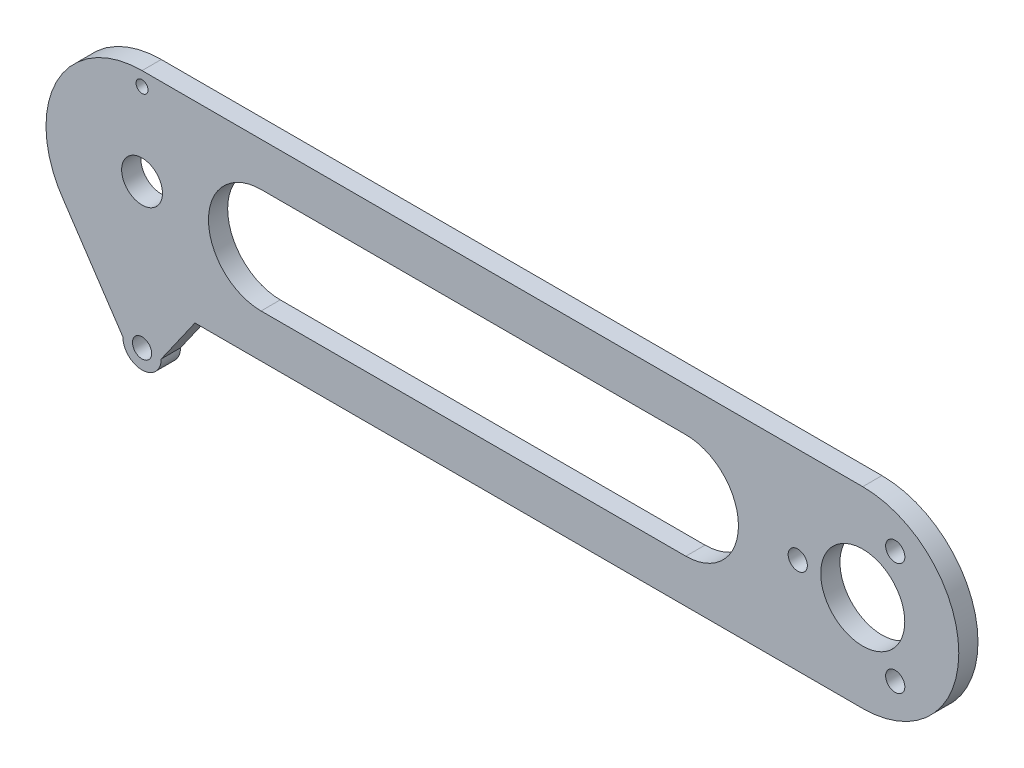
ISO-10303-21;
HEADER;
FILE_DESCRIPTION(('STEP AP214'),'2;1');
FILE_NAME('part.step','',(''),(''),'','','');
FILE_SCHEMA(('AUTOMOTIVE_DESIGN { 1 0 10303 214 1 1 1 1 }'));
ENDSEC;
DATA;
#1=APPLICATION_CONTEXT('core data for automotive mechanical design processes');
#2=APPLICATION_PROTOCOL_DEFINITION('international standard','automotive_design',2000,#1);
#3=PRODUCT_CONTEXT('',#1,'mechanical');
#4=PRODUCT('Part','Part','',(#3));
#5=PRODUCT_RELATED_PRODUCT_CATEGORY('part','',(#4));
#6=PRODUCT_DEFINITION_FORMATION('','',#4);
#7=PRODUCT_DEFINITION_CONTEXT('part definition',#1,'design');
#8=PRODUCT_DEFINITION('design','',#6,#7);
#9=PRODUCT_DEFINITION_SHAPE('','',#8);
#10=(LENGTH_UNIT() NAMED_UNIT(*) SI_UNIT(.MILLI.,.METRE.));
#11=(NAMED_UNIT(*) PLANE_ANGLE_UNIT() SI_UNIT($,.RADIAN.));
#12=(NAMED_UNIT(*) SI_UNIT($,.STERADIAN.) SOLID_ANGLE_UNIT());
#13=UNCERTAINTY_MEASURE_WITH_UNIT(LENGTH_MEASURE(1.E-05),#10,'distance_accuracy_value','');
#14=(GEOMETRIC_REPRESENTATION_CONTEXT(3) GLOBAL_UNCERTAINTY_ASSIGNED_CONTEXT((#13)) GLOBAL_UNIT_ASSIGNED_CONTEXT((#10,
#11,#12)) REPRESENTATION_CONTEXT('',''));
#15=CARTESIAN_POINT('',(0.,0.,0.));
#16=DIRECTION('',(0.,0.,1.));
#17=DIRECTION('',(1.,0.,0.));
#18=AXIS2_PLACEMENT_3D('',#15,#16,#17);
#19=CARTESIAN_POINT('',(-1.00000000000001,0.,4.));
#20=DIRECTION('',(0.,0.,-1.));
#21=DIRECTION('',(-1.,0.,0.));
#22=AXIS2_PLACEMENT_3D('',#19,#20,#21);
#23=PLANE('',#22);
#24=CARTESIAN_POINT('',(155.82929500564,11.7173237132035,4.));
#25=DIRECTION('',(0.,0.,1.));
#26=DIRECTION('',(1.,0.,0.));
#27=AXIS2_PLACEMENT_3D('',#24,#25,#26);
#28=CIRCLE('',#27,2.);
#29=CARTESIAN_POINT('',(157.82929500564,11.7173237132035,4.));
#30=VERTEX_POINT('',#29);
#31=EDGE_CURVE('E174',#30,#30,#28,.T.);
#32=ORIENTED_EDGE('',*,*,#31,.F.);
#33=EDGE_LOOP('',(#32));
#34=FACE_BOUND('',#33,.T.);
#35=CARTESIAN_POINT('',(-0.999999999999992,-30.,4.));
#36=DIRECTION('',(0.,0.,1.));
#37=DIRECTION('',(1.,0.,0.));
#38=AXIS2_PLACEMENT_3D('',#35,#36,#37);
#39=CIRCLE('',#38,2.);
#40=CARTESIAN_POINT('',(1.00000000000001,-30.,4.));
#41=VERTEX_POINT('',#40);
#42=EDGE_CURVE('E182',#41,#41,#39,.T.);
#43=ORIENTED_EDGE('',*,*,#42,.F.);
#44=EDGE_LOOP('',(#43));
#45=FACE_BOUND('',#44,.T.);
#46=CARTESIAN_POINT('',(135.53429500564,0.,4.));
#47=DIRECTION('',(0.,0.,1.));
#48=DIRECTION('',(1.,0.,0.));
#49=AXIS2_PLACEMENT_3D('',#46,#47,#48);
#50=CIRCLE('',#49,2.);
#51=CARTESIAN_POINT('',(137.53429500564,0.,4.));
#52=VERTEX_POINT('',#51);
#53=EDGE_CURVE('E190',#52,#52,#50,.T.);
#54=ORIENTED_EDGE('',*,*,#53,.F.);
#55=EDGE_LOOP('',(#54));
#56=FACE_BOUND('',#55,.T.);
#57=CARTESIAN_POINT('',(-0.999999999999996,0.,4.));
#58=DIRECTION('',(0.,0.,1.));
#59=DIRECTION('',(1.,0.,0.));
#60=AXIS2_PLACEMENT_3D('',#57,#58,#59);
#61=CIRCLE('',#60,4.25);
#62=CARTESIAN_POINT('',(3.25,0.,4.));
#63=VERTEX_POINT('',#62);
#64=EDGE_CURVE('E198',#63,#63,#61,.T.);
#65=ORIENTED_EDGE('',*,*,#64,.F.);
#66=EDGE_LOOP('',(#65));
#67=FACE_BOUND('',#66,.T.);
#68=CARTESIAN_POINT('',(-1.00000000000001,0.,4.));
#69=DIRECTION('',(0.,0.,1.));
#70=DIRECTION('',(-1.,0.,0.));
#71=AXIS2_PLACEMENT_3D('',#68,#69,#70);
#72=CIRCLE('',#71,20.);
#73=CARTESIAN_POINT('',(-1.,20.,4.));
#74=VERTEX_POINT('',#73);
#75=CARTESIAN_POINT('',(-17.2081561258522,-11.7173237132034,4.));
#76=VERTEX_POINT('',#75);
#77=EDGE_CURVE('E206',#74,#76,#72,.T.);
#78=ORIENTED_EDGE('',*,*,#77,.T.);
#79=DIRECTION('',(0.555320589704318,-0.83163636443487,0.));
#80=VECTOR('',#79,1.);
#81=CARTESIAN_POINT('',(-4.99999999999999,-30.,4.));
#82=LINE('',#81,#80);
#83=CARTESIAN_POINT('',(-4.99999999999999,-30.,4.));
#84=VERTEX_POINT('',#83);
#85=EDGE_CURVE('E210',#76,#84,#82,.T.);
#86=ORIENTED_EDGE('',*,*,#85,.T.);
#87=CARTESIAN_POINT('',(-0.999999999999992,-30.,4.));
#88=DIRECTION('',(0.,0.,1.));
#89=DIRECTION('',(1.,0.,0.));
#90=AXIS2_PLACEMENT_3D('',#87,#88,#89);
#91=CIRCLE('',#90,4.);
#92=CARTESIAN_POINT('',(3.00000000000001,-30.,4.));
#93=VERTEX_POINT('',#92);
#94=EDGE_CURVE('E214',#84,#93,#91,.T.);
#95=ORIENTED_EDGE('',*,*,#94,.T.);
#96=DIRECTION('',(0.574260620658506,0.818672547213419,0.));
#97=VECTOR('',#96,1.);
#98=CARTESIAN_POINT('',(3.00000000000001,-30.,4.));
#99=LINE('',#98,#97);
#100=CARTESIAN_POINT('',(10.0145337426198,-20.,4.));
#101=VERTEX_POINT('',#100);
#102=EDGE_CURVE('E217',#93,#101,#99,.T.);
#103=ORIENTED_EDGE('',*,*,#102,.T.);
#104=DIRECTION('',(1.,0.,0.));
#105=VECTOR('',#104,1.);
#106=CARTESIAN_POINT('',(149.06429500564,-20.,4.));
#107=LINE('',#106,#105);
#108=CARTESIAN_POINT('',(149.06429500564,-20.,4.));
#109=VERTEX_POINT('',#108);
#110=EDGE_CURVE('E220',#101,#109,#107,.T.);
#111=ORIENTED_EDGE('',*,*,#110,.T.);
#112=CARTESIAN_POINT('',(149.06429500564,0.,4.));
#113=DIRECTION('',(0.,0.,1.));
#114=DIRECTION('',(-1.,0.,0.));
#115=AXIS2_PLACEMENT_3D('',#112,#113,#114);
#116=CIRCLE('',#115,20.);
#117=CARTESIAN_POINT('',(149.06429500564,20.,4.));
#118=VERTEX_POINT('',#117);
#119=EDGE_CURVE('E223',#109,#118,#116,.T.);
#120=ORIENTED_EDGE('',*,*,#119,.T.);
#121=DIRECTION('',(-1.,0.,0.));
#122=VECTOR('',#121,1.);
#123=CARTESIAN_POINT('',(-1.,20.,4.));
#124=LINE('',#123,#122);
#125=EDGE_CURVE('E226',#118,#74,#124,.T.);
#126=ORIENTED_EDGE('',*,*,#125,.T.);
#127=EDGE_LOOP('',(#78,#86,#95,#103,#111,#120,#126));
#128=FACE_BOUND('',#127,.T.);
#129=CARTESIAN_POINT('',(23.7835213403292,0.,4.));
#130=DIRECTION('',(0.,0.,1.));
#131=DIRECTION('',(1.,0.,0.));
#132=AXIS2_PLACEMENT_3D('',#129,#130,#131);
#133=CIRCLE('',#132,10.953852889672);
#134=CARTESIAN_POINT('',(23.7835213403292,10.953852889672,4.));
#135=VERTEX_POINT('',#134);
#136=CARTESIAN_POINT('',(23.7835213403292,-10.953852889672,4.));
#137=VERTEX_POINT('',#136);
#138=EDGE_CURVE('E123',#135,#137,#133,.T.);
#139=ORIENTED_EDGE('',*,*,#138,.F.);
#140=DIRECTION('',(-1.,0.,0.));
#141=VECTOR('',#140,1.);
#142=CARTESIAN_POINT('',(23.7835213403292,10.953852889672,4.));
#143=LINE('',#142,#141);
#144=CARTESIAN_POINT('',(112.230567297985,10.953852889672,4.));
#145=VERTEX_POINT('',#144);
#146=EDGE_CURVE('E150',#145,#135,#143,.T.);
#147=ORIENTED_EDGE('',*,*,#146,.F.);
#148=CARTESIAN_POINT('',(112.230567297985,0.,4.));
#149=DIRECTION('',(0.,0.,1.));
#150=DIRECTION('',(1.,0.,0.));
#151=AXIS2_PLACEMENT_3D('',#148,#149,#150);
#152=CIRCLE('',#151,10.9538528896721);
#153=CARTESIAN_POINT('',(112.230567297985,-10.9538528896721,4.));
#154=VERTEX_POINT('',#153);
#155=EDGE_CURVE('E146',#154,#145,#152,.T.);
#156=ORIENTED_EDGE('',*,*,#155,.F.);
#157=DIRECTION('',(1.,0.,0.));
#158=VECTOR('',#157,1.);
#159=CARTESIAN_POINT('',(23.7835213403292,-10.953852889672,4.));
#160=LINE('',#159,#158);
#161=EDGE_CURVE('E132',#137,#154,#160,.T.);
#162=ORIENTED_EDGE('',*,*,#161,.F.);
#163=EDGE_LOOP('',(#139,#147,#156,#162));
#164=FACE_BOUND('',#163,.T.);
#165=CARTESIAN_POINT('',(155.82929500564,-11.7173237132034,4.));
#166=DIRECTION('',(0.,0.,1.));
#167=DIRECTION('',(1.,0.,0.));
#168=AXIS2_PLACEMENT_3D('',#165,#166,#167);
#169=CIRCLE('',#168,2.);
#170=CARTESIAN_POINT('',(157.82929500564,-11.7173237132034,4.));
#171=VERTEX_POINT('',#170);
#172=EDGE_CURVE('E158',#171,#171,#169,.T.);
#173=ORIENTED_EDGE('',*,*,#172,.F.);
#174=EDGE_LOOP('',(#173));
#175=FACE_BOUND('',#174,.T.);
#176=CARTESIAN_POINT('',(149.06429500564,0.,4.));
#177=DIRECTION('',(0.,0.,1.));
#178=DIRECTION('',(1.,0.,0.));
#179=AXIS2_PLACEMENT_3D('',#176,#177,#178);
#180=CIRCLE('',#179,8.75);
#181=CARTESIAN_POINT('',(157.81429500564,0.,4.));
#182=VERTEX_POINT('',#181);
#183=EDGE_CURVE('E379',#182,#182,#180,.T.);
#184=ORIENTED_EDGE('',*,*,#183,.F.);
#185=EDGE_LOOP('',(#184));
#186=FACE_BOUND('',#185,.T.);
#187=CARTESIAN_POINT('',(-0.999999999999998,17.12,4.));
#188=DIRECTION('',(0.,0.,1.));
#189=DIRECTION('',(1.,0.,0.));
#190=AXIS2_PLACEMENT_3D('',#187,#188,#189);
#191=CIRCLE('',#190,1.25);
#192=CARTESIAN_POINT('',(0.250000000000003,17.12,4.));
#193=VERTEX_POINT('',#192);
#194=EDGE_CURVE('E368',#193,#193,#191,.T.);
#195=ORIENTED_EDGE('',*,*,#194,.F.);
#196=EDGE_LOOP('',(#195));
#197=FACE_BOUND('',#196,.T.);
#198=ADVANCED_FACE('F39',(#34,#45,#56,#67,#128,#164,#175,#186,#197),#23,.F.);
#199=CARTESIAN_POINT('',(-1.00000000000001,0.,0.));
#200=DIRECTION('',(0.,0.,-1.));
#201=DIRECTION('',(-1.,0.,0.));
#202=AXIS2_PLACEMENT_3D('',#199,#200,#201);
#203=PLANE('',#202);
#204=CARTESIAN_POINT('',(149.06429500564,0.,0.));
#205=DIRECTION('',(0.,0.,1.));
#206=DIRECTION('',(1.,0.,0.));
#207=AXIS2_PLACEMENT_3D('',#204,#205,#206);
#208=CIRCLE('',#207,8.75);
#209=CARTESIAN_POINT('',(157.81429500564,0.,0.));
#210=VERTEX_POINT('',#209);
#211=EDGE_CURVE('E376',#210,#210,#208,.T.);
#212=ORIENTED_EDGE('',*,*,#211,.T.);
#213=EDGE_LOOP('',(#212));
#214=FACE_BOUND('',#213,.T.);
#215=DIRECTION('',(-1.,0.,0.));
#216=VECTOR('',#215,1.);
#217=CARTESIAN_POINT('',(23.7835213403292,10.953852889672,0.));
#218=LINE('',#217,#216);
#219=CARTESIAN_POINT('',(112.230567297985,10.953852889672,0.));
#220=VERTEX_POINT('',#219);
#221=CARTESIAN_POINT('',(23.7835213403292,10.953852889672,0.));
#222=VERTEX_POINT('',#221);
#223=EDGE_CURVE('E133',#220,#222,#218,.T.);
#224=ORIENTED_EDGE('',*,*,#223,.T.);
#225=CARTESIAN_POINT('',(23.7835213403292,0.,0.));
#226=DIRECTION('',(0.,0.,1.));
#227=DIRECTION('',(1.,0.,0.));
#228=AXIS2_PLACEMENT_3D('',#225,#226,#227);
#229=CIRCLE('',#228,10.953852889672);
#230=CARTESIAN_POINT('',(23.7835213403292,-10.953852889672,0.));
#231=VERTEX_POINT('',#230);
#232=EDGE_CURVE('E63',#222,#231,#229,.T.);
#233=ORIENTED_EDGE('',*,*,#232,.T.);
#234=DIRECTION('',(1.,0.,0.));
#235=VECTOR('',#234,1.);
#236=CARTESIAN_POINT('',(23.7835213403292,-10.953852889672,0.));
#237=LINE('',#236,#235);
#238=CARTESIAN_POINT('',(112.230567297985,-10.9538528896721,0.));
#239=VERTEX_POINT('',#238);
#240=EDGE_CURVE('E139',#231,#239,#237,.T.);
#241=ORIENTED_EDGE('',*,*,#240,.T.);
#242=CARTESIAN_POINT('',(112.230567297985,0.,0.));
#243=DIRECTION('',(0.,0.,1.));
#244=DIRECTION('',(1.,0.,0.));
#245=AXIS2_PLACEMENT_3D('',#242,#243,#244);
#246=CIRCLE('',#245,10.9538528896721);
#247=EDGE_CURVE('E161',#239,#220,#246,.T.);
#248=ORIENTED_EDGE('',*,*,#247,.T.);
#249=EDGE_LOOP('',(#224,#233,#241,#248));
#250=FACE_BOUND('',#249,.T.);
#251=CARTESIAN_POINT('',(155.82929500564,11.7173237132035,0.));
#252=DIRECTION('',(0.,0.,1.));
#253=DIRECTION('',(1.,0.,0.));
#254=AXIS2_PLACEMENT_3D('',#251,#252,#253);
#255=CIRCLE('',#254,2.);
#256=CARTESIAN_POINT('',(157.82929500564,11.7173237132035,0.));
#257=VERTEX_POINT('',#256);
#258=EDGE_CURVE('E141',#257,#257,#255,.T.);
#259=ORIENTED_EDGE('',*,*,#258,.T.);
#260=EDGE_LOOP('',(#259));
#261=FACE_BOUND('',#260,.T.);
#262=CARTESIAN_POINT('',(135.53429500564,0.,0.));
#263=DIRECTION('',(0.,0.,1.));
#264=DIRECTION('',(1.,0.,0.));
#265=AXIS2_PLACEMENT_3D('',#262,#263,#264);
#266=CIRCLE('',#265,2.);
#267=CARTESIAN_POINT('',(137.53429500564,0.,0.));
#268=VERTEX_POINT('',#267);
#269=EDGE_CURVE('E186',#268,#268,#266,.T.);
#270=ORIENTED_EDGE('',*,*,#269,.T.);
#271=EDGE_LOOP('',(#270));
#272=FACE_BOUND('',#271,.T.);
#273=CARTESIAN_POINT('',(-1.00000000000001,0.,0.));
#274=DIRECTION('',(0.,0.,1.));
#275=DIRECTION('',(-1.,0.,0.));
#276=AXIS2_PLACEMENT_3D('',#273,#274,#275);
#277=CIRCLE('',#276,20.);
#278=CARTESIAN_POINT('',(-1.,20.,0.));
#279=VERTEX_POINT('',#278);
#280=CARTESIAN_POINT('',(-17.2081561258522,-11.7173237132034,0.));
#281=VERTEX_POINT('',#280);
#282=EDGE_CURVE('E202',#279,#281,#277,.T.);
#283=ORIENTED_EDGE('',*,*,#282,.F.);
#284=DIRECTION('',(-1.,0.,0.));
#285=VECTOR('',#284,1.);
#286=CARTESIAN_POINT('',(-1.,20.,0.));
#287=LINE('',#286,#285);
#288=CARTESIAN_POINT('',(149.06429500564,20.,0.));
#289=VERTEX_POINT('',#288);
#290=EDGE_CURVE('E211',#289,#279,#287,.T.);
#291=ORIENTED_EDGE('',*,*,#290,.F.);
#292=CARTESIAN_POINT('',(149.06429500564,0.,0.));
#293=DIRECTION('',(0.,0.,1.));
#294=DIRECTION('',(-1.,0.,0.));
#295=AXIS2_PLACEMENT_3D('',#292,#293,#294);
#296=CIRCLE('',#295,20.);
#297=CARTESIAN_POINT('',(149.06429500564,-20.,0.));
#298=VERTEX_POINT('',#297);
#299=EDGE_CURVE('E245',#298,#289,#296,.T.);
#300=ORIENTED_EDGE('',*,*,#299,.F.);
#301=DIRECTION('',(1.,0.,0.));
#302=VECTOR('',#301,1.);
#303=CARTESIAN_POINT('',(149.06429500564,-20.,0.));
#304=LINE('',#303,#302);
#305=CARTESIAN_POINT('',(10.0145337426198,-20.,0.));
#306=VERTEX_POINT('',#305);
#307=EDGE_CURVE('E242',#306,#298,#304,.T.);
#308=ORIENTED_EDGE('',*,*,#307,.F.);
#309=DIRECTION('',(0.574260620658506,0.818672547213419,0.));
#310=VECTOR('',#309,1.);
#311=CARTESIAN_POINT('',(3.00000000000001,-30.,0.));
#312=LINE('',#311,#310);
#313=CARTESIAN_POINT('',(3.00000000000001,-30.,0.));
#314=VERTEX_POINT('',#313);
#315=EDGE_CURVE('E239',#314,#306,#312,.T.);
#316=ORIENTED_EDGE('',*,*,#315,.F.);
#317=CARTESIAN_POINT('',(-0.999999999999992,-30.,0.));
#318=DIRECTION('',(0.,0.,1.));
#319=DIRECTION('',(1.,0.,0.));
#320=AXIS2_PLACEMENT_3D('',#317,#318,#319);
#321=CIRCLE('',#320,4.);
#322=CARTESIAN_POINT('',(-4.99999999999999,-30.,0.));
#323=VERTEX_POINT('',#322);
#324=EDGE_CURVE('E236',#323,#314,#321,.T.);
#325=ORIENTED_EDGE('',*,*,#324,.F.);
#326=DIRECTION('',(0.555320589704318,-0.83163636443487,0.));
#327=VECTOR('',#326,1.);
#328=CARTESIAN_POINT('',(-4.99999999999999,-30.,0.));
#329=LINE('',#328,#327);
#330=EDGE_CURVE('E233',#281,#323,#329,.T.);
#331=ORIENTED_EDGE('',*,*,#330,.F.);
#332=EDGE_LOOP('',(#283,#291,#300,#308,#316,#325,#331));
#333=FACE_BOUND('',#332,.T.);
#334=CARTESIAN_POINT('',(-0.999999999999996,0.,0.));
#335=DIRECTION('',(0.,0.,1.));
#336=DIRECTION('',(1.,0.,0.));
#337=AXIS2_PLACEMENT_3D('',#334,#335,#336);
#338=CIRCLE('',#337,4.25);
#339=CARTESIAN_POINT('',(3.25,0.,0.));
#340=VERTEX_POINT('',#339);
#341=EDGE_CURVE('E194',#340,#340,#338,.T.);
#342=ORIENTED_EDGE('',*,*,#341,.T.);
#343=EDGE_LOOP('',(#342));
#344=FACE_BOUND('',#343,.T.);
#345=CARTESIAN_POINT('',(-0.999999999999992,-30.,0.));
#346=DIRECTION('',(0.,0.,1.));
#347=DIRECTION('',(1.,0.,0.));
#348=AXIS2_PLACEMENT_3D('',#345,#346,#347);
#349=CIRCLE('',#348,2.);
#350=CARTESIAN_POINT('',(1.00000000000001,-30.,0.));
#351=VERTEX_POINT('',#350);
#352=EDGE_CURVE('E178',#351,#351,#349,.T.);
#353=ORIENTED_EDGE('',*,*,#352,.T.);
#354=EDGE_LOOP('',(#353));
#355=FACE_BOUND('',#354,.T.);
#356=CARTESIAN_POINT('',(155.82929500564,-11.7173237132034,0.));
#357=DIRECTION('',(0.,0.,1.));
#358=DIRECTION('',(1.,0.,0.));
#359=AXIS2_PLACEMENT_3D('',#356,#357,#358);
#360=CIRCLE('',#359,2.);
#361=CARTESIAN_POINT('',(157.82929500564,-11.7173237132034,0.));
#362=VERTEX_POINT('',#361);
#363=EDGE_CURVE('E383',#362,#362,#360,.T.);
#364=ORIENTED_EDGE('',*,*,#363,.T.);
#365=EDGE_LOOP('',(#364));
#366=FACE_BOUND('',#365,.T.);
#367=CARTESIAN_POINT('',(-0.999999999999998,17.12,0.));
#368=DIRECTION('',(0.,0.,1.));
#369=DIRECTION('',(1.,0.,0.));
#370=AXIS2_PLACEMENT_3D('',#367,#368,#369);
#371=CIRCLE('',#370,1.25);
#372=CARTESIAN_POINT('',(0.250000000000003,17.12,0.));
#373=VERTEX_POINT('',#372);
#374=EDGE_CURVE('E371',#373,#373,#371,.T.);
#375=ORIENTED_EDGE('',*,*,#374,.T.);
#376=EDGE_LOOP('',(#375));
#377=FACE_BOUND('',#376,.T.);
#378=ADVANCED_FACE('F280',(#214,#250,#261,#272,#333,#344,#355,#366,#377),#203,.T.);
#379=CARTESIAN_POINT('',(-1.00000000000001,0.,4.));
#380=DIRECTION('',(0.,0.,-1.));
#381=DIRECTION('',(-1.,0.,0.));
#382=AXIS2_PLACEMENT_3D('',#379,#380,#381);
#383=CYLINDRICAL_SURFACE('',#382,20.);
#384=ORIENTED_EDGE('',*,*,#282,.T.);
#385=DIRECTION('',(0.,0.,-1.));
#386=VECTOR('',#385,1.);
#387=CARTESIAN_POINT('',(-17.2081561258522,-11.7173237132034,4.));
#388=LINE('',#387,#386);
#389=EDGE_CURVE('E11',#76,#281,#388,.T.);
#390=ORIENTED_EDGE('',*,*,#389,.F.);
#391=ORIENTED_EDGE('',*,*,#77,.F.);
#392=DIRECTION('',(0.,0.,-1.));
#393=VECTOR('',#392,1.);
#394=CARTESIAN_POINT('',(-1.,20.,4.));
#395=LINE('',#394,#393);
#396=EDGE_CURVE('E229',#74,#279,#395,.T.);
#397=ORIENTED_EDGE('',*,*,#396,.T.);
#398=EDGE_LOOP('',(#384,#390,#391,#397));
#399=FACE_BOUND('',#398,.T.);
#400=ADVANCED_FACE('F41',(#399),#383,.T.);
#401=CARTESIAN_POINT('',(-4.99999999999999,-30.,4.));
#402=DIRECTION('',(0.83163636443487,0.555320589704318,0.));
#403=DIRECTION('',(-0.555320589704318,0.83163636443487,0.));
#404=AXIS2_PLACEMENT_3D('',#401,#402,#403);
#405=PLANE('',#404);
#406=ORIENTED_EDGE('',*,*,#330,.T.);
#407=DIRECTION('',(0.,0.,-1.));
#408=VECTOR('',#407,1.);
#409=CARTESIAN_POINT('',(-4.99999999999999,-30.,4.));
#410=LINE('',#409,#408);
#411=EDGE_CURVE('E48',#84,#323,#410,.T.);
#412=ORIENTED_EDGE('',*,*,#411,.F.);
#413=ORIENTED_EDGE('',*,*,#85,.F.);
#414=ORIENTED_EDGE('',*,*,#389,.T.);
#415=EDGE_LOOP('',(#406,#412,#413,#414));
#416=FACE_BOUND('',#415,.T.);
#417=ADVANCED_FACE('F297',(#416),#405,.F.);
#418=CARTESIAN_POINT('',(-0.999999999999992,-30.,4.));
#419=DIRECTION('',(0.,0.,-1.));
#420=DIRECTION('',(-1.,0.,0.));
#421=AXIS2_PLACEMENT_3D('',#418,#419,#420);
#422=CYLINDRICAL_SURFACE('',#421,4.);
#423=ORIENTED_EDGE('',*,*,#324,.T.);
#424=DIRECTION('',(0.,0.,-1.));
#425=VECTOR('',#424,1.);
#426=CARTESIAN_POINT('',(3.00000000000001,-30.,4.));
#427=LINE('',#426,#425);
#428=EDGE_CURVE('E265',#93,#314,#427,.T.);
#429=ORIENTED_EDGE('',*,*,#428,.F.);
#430=ORIENTED_EDGE('',*,*,#94,.F.);
#431=ORIENTED_EDGE('',*,*,#411,.T.);
#432=EDGE_LOOP('',(#423,#429,#430,#431));
#433=FACE_BOUND('',#432,.T.);
#434=ADVANCED_FACE('F274',(#433),#422,.T.);
#435=CARTESIAN_POINT('',(3.00000000000001,-30.,4.));
#436=DIRECTION('',(-0.818672547213419,0.574260620658506,0.));
#437=DIRECTION('',(-0.574260620658506,-0.818672547213419,0.));
#438=AXIS2_PLACEMENT_3D('',#435,#436,#437);
#439=PLANE('',#438);
#440=ORIENTED_EDGE('',*,*,#315,.T.);
#441=DIRECTION('',(0.,0.,-1.));
#442=VECTOR('',#441,1.);
#443=CARTESIAN_POINT('',(10.0145337426198,-20.,4.));
#444=LINE('',#443,#442);
#445=EDGE_CURVE('E261',#101,#306,#444,.T.);
#446=ORIENTED_EDGE('',*,*,#445,.F.);
#447=ORIENTED_EDGE('',*,*,#102,.F.);
#448=ORIENTED_EDGE('',*,*,#428,.T.);
#449=EDGE_LOOP('',(#440,#446,#447,#448));
#450=FACE_BOUND('',#449,.T.);
#451=ADVANCED_FACE('F286',(#450),#439,.F.);
#452=CARTESIAN_POINT('',(149.06429500564,-20.,4.));
#453=DIRECTION('',(0.,1.,0.));
#454=DIRECTION('',(-1.,0.,0.));
#455=AXIS2_PLACEMENT_3D('',#452,#453,#454);
#456=PLANE('',#455);
#457=ORIENTED_EDGE('',*,*,#307,.T.);
#458=DIRECTION('',(0.,0.,-1.));
#459=VECTOR('',#458,1.);
#460=CARTESIAN_POINT('',(149.06429500564,-20.,4.));
#461=LINE('',#460,#459);
#462=EDGE_CURVE('E257',#109,#298,#461,.T.);
#463=ORIENTED_EDGE('',*,*,#462,.F.);
#464=ORIENTED_EDGE('',*,*,#110,.F.);
#465=ORIENTED_EDGE('',*,*,#445,.T.);
#466=EDGE_LOOP('',(#457,#463,#464,#465));
#467=FACE_BOUND('',#466,.T.);
#468=ADVANCED_FACE('F290',(#467),#456,.F.);
#469=CARTESIAN_POINT('',(149.06429500564,0.,4.));
#470=DIRECTION('',(0.,0.,-1.));
#471=DIRECTION('',(-1.,0.,0.));
#472=AXIS2_PLACEMENT_3D('',#469,#470,#471);
#473=CYLINDRICAL_SURFACE('',#472,20.);
#474=ORIENTED_EDGE('',*,*,#299,.T.);
#475=DIRECTION('',(0.,0.,-1.));
#476=VECTOR('',#475,1.);
#477=CARTESIAN_POINT('',(149.06429500564,20.,4.));
#478=LINE('',#477,#476);
#479=EDGE_CURVE('E253',#118,#289,#478,.T.);
#480=ORIENTED_EDGE('',*,*,#479,.F.);
#481=ORIENTED_EDGE('',*,*,#119,.F.);
#482=ORIENTED_EDGE('',*,*,#462,.T.);
#483=EDGE_LOOP('',(#474,#480,#481,#482));
#484=FACE_BOUND('',#483,.T.);
#485=ADVANCED_FACE('F305',(#484),#473,.T.);
#486=CARTESIAN_POINT('',(-1.,20.,4.));
#487=DIRECTION('',(0.,-1.,0.));
#488=DIRECTION('',(0.,0.,-1.));
#489=AXIS2_PLACEMENT_3D('',#486,#487,#488);
#490=PLANE('',#489);
#491=ORIENTED_EDGE('',*,*,#290,.T.);
#492=ORIENTED_EDGE('',*,*,#396,.F.);
#493=ORIENTED_EDGE('',*,*,#125,.F.);
#494=ORIENTED_EDGE('',*,*,#479,.T.);
#495=EDGE_LOOP('',(#491,#492,#493,#494));
#496=FACE_BOUND('',#495,.T.);
#497=ADVANCED_FACE('F302',(#496),#490,.F.);
#498=CARTESIAN_POINT('',(-0.999999999999996,0.,4.));
#499=DIRECTION('',(0.,0.,-1.));
#500=DIRECTION('',(-1.,0.,0.));
#501=AXIS2_PLACEMENT_3D('',#498,#499,#500);
#502=CYLINDRICAL_SURFACE('',#501,4.25);
#503=ORIENTED_EDGE('',*,*,#64,.T.);
#504=EDGE_LOOP('',(#503));
#505=FACE_BOUND('',#504,.T.);
#506=ORIENTED_EDGE('',*,*,#341,.F.);
#507=EDGE_LOOP('',(#506));
#508=FACE_BOUND('',#507,.T.);
#509=ADVANCED_FACE('F312',(#505,#508),#502,.F.);
#510=CARTESIAN_POINT('',(135.53429500564,0.,4.));
#511=DIRECTION('',(0.,0.,-1.));
#512=DIRECTION('',(-1.,0.,0.));
#513=AXIS2_PLACEMENT_3D('',#510,#511,#512);
#514=CYLINDRICAL_SURFACE('',#513,2.);
#515=ORIENTED_EDGE('',*,*,#53,.T.);
#516=EDGE_LOOP('',(#515));
#517=FACE_BOUND('',#516,.T.);
#518=ORIENTED_EDGE('',*,*,#269,.F.);
#519=EDGE_LOOP('',(#518));
#520=FACE_BOUND('',#519,.T.);
#521=ADVANCED_FACE('F328',(#517,#520),#514,.F.);
#522=CARTESIAN_POINT('',(-0.999999999999992,-30.,4.));
#523=DIRECTION('',(0.,0.,-1.));
#524=DIRECTION('',(-1.,0.,0.));
#525=AXIS2_PLACEMENT_3D('',#522,#523,#524);
#526=CYLINDRICAL_SURFACE('',#525,2.);
#527=ORIENTED_EDGE('',*,*,#42,.T.);
#528=EDGE_LOOP('',(#527));
#529=FACE_BOUND('',#528,.T.);
#530=ORIENTED_EDGE('',*,*,#352,.F.);
#531=EDGE_LOOP('',(#530));
#532=FACE_BOUND('',#531,.T.);
#533=ADVANCED_FACE('F332',(#529,#532),#526,.F.);
#534=CARTESIAN_POINT('',(155.82929500564,11.7173237132035,4.));
#535=DIRECTION('',(0.,0.,-1.));
#536=DIRECTION('',(-1.,0.,0.));
#537=AXIS2_PLACEMENT_3D('',#534,#535,#536);
#538=CYLINDRICAL_SURFACE('',#537,2.);
#539=ORIENTED_EDGE('',*,*,#31,.T.);
#540=EDGE_LOOP('',(#539));
#541=FACE_BOUND('',#540,.T.);
#542=ORIENTED_EDGE('',*,*,#258,.F.);
#543=EDGE_LOOP('',(#542));
#544=FACE_BOUND('',#543,.T.);
#545=ADVANCED_FACE('F336',(#541,#544),#538,.F.);
#546=CARTESIAN_POINT('',(23.7835213403292,0.,4.));
#547=DIRECTION('',(0.,0.,-1.));
#548=DIRECTION('',(-1.,0.,0.));
#549=AXIS2_PLACEMENT_3D('',#546,#547,#548);
#550=CYLINDRICAL_SURFACE('',#549,10.953852889672);
#551=ORIENTED_EDGE('',*,*,#232,.F.);
#552=DIRECTION('',(0.,0.,-1.));
#553=VECTOR('',#552,1.);
#554=CARTESIAN_POINT('',(23.7835213403292,10.953852889672,4.));
#555=LINE('',#554,#553);
#556=EDGE_CURVE('E127',#135,#222,#555,.T.);
#557=ORIENTED_EDGE('',*,*,#556,.F.);
#558=ORIENTED_EDGE('',*,*,#138,.T.);
#559=DIRECTION('',(0.,0.,-1.));
#560=VECTOR('',#559,1.);
#561=CARTESIAN_POINT('',(23.7835213403292,-10.953852889672,4.));
#562=LINE('',#561,#560);
#563=EDGE_CURVE('E126',#137,#231,#562,.T.);
#564=ORIENTED_EDGE('',*,*,#563,.T.);
#565=EDGE_LOOP('',(#551,#557,#558,#564));
#566=FACE_BOUND('',#565,.T.);
#567=ADVANCED_FACE('F125',(#566),#550,.F.);
#568=CARTESIAN_POINT('',(23.7835213403292,-10.953852889672,4.));
#569=DIRECTION('',(0.,1.,0.));
#570=DIRECTION('',(-1.,0.,0.));
#571=AXIS2_PLACEMENT_3D('',#568,#569,#570);
#572=PLANE('',#571);
#573=ORIENTED_EDGE('',*,*,#240,.F.);
#574=ORIENTED_EDGE('',*,*,#563,.F.);
#575=ORIENTED_EDGE('',*,*,#161,.T.);
#576=DIRECTION('',(0.,0.,-1.));
#577=VECTOR('',#576,1.);
#578=CARTESIAN_POINT('',(112.230567297985,-10.9538528896721,4.));
#579=LINE('',#578,#577);
#580=EDGE_CURVE('E142',#154,#239,#579,.T.);
#581=ORIENTED_EDGE('',*,*,#580,.T.);
#582=EDGE_LOOP('',(#573,#574,#575,#581));
#583=FACE_BOUND('',#582,.T.);
#584=ADVANCED_FACE('F136',(#583),#572,.T.);
#585=CARTESIAN_POINT('',(112.230567297985,0.,4.));
#586=DIRECTION('',(0.,0.,-1.));
#587=DIRECTION('',(-1.,0.,0.));
#588=AXIS2_PLACEMENT_3D('',#585,#586,#587);
#589=CYLINDRICAL_SURFACE('',#588,10.9538528896721);
#590=ORIENTED_EDGE('',*,*,#247,.F.);
#591=ORIENTED_EDGE('',*,*,#580,.F.);
#592=ORIENTED_EDGE('',*,*,#155,.T.);
#593=DIRECTION('',(0.,0.,-1.));
#594=VECTOR('',#593,1.);
#595=CARTESIAN_POINT('',(112.230567297985,10.953852889672,4.));
#596=LINE('',#595,#594);
#597=EDGE_CURVE('E55',#145,#220,#596,.T.);
#598=ORIENTED_EDGE('',*,*,#597,.T.);
#599=EDGE_LOOP('',(#590,#591,#592,#598));
#600=FACE_BOUND('',#599,.T.);
#601=ADVANCED_FACE('F345',(#600),#589,.F.);
#602=CARTESIAN_POINT('',(23.7835213403292,10.953852889672,4.));
#603=DIRECTION('',(0.,-1.,0.));
#604=DIRECTION('',(0.,0.,-1.));
#605=AXIS2_PLACEMENT_3D('',#602,#603,#604);
#606=PLANE('',#605);
#607=ORIENTED_EDGE('',*,*,#223,.F.);
#608=ORIENTED_EDGE('',*,*,#597,.F.);
#609=ORIENTED_EDGE('',*,*,#146,.T.);
#610=ORIENTED_EDGE('',*,*,#556,.T.);
#611=EDGE_LOOP('',(#607,#608,#609,#610));
#612=FACE_BOUND('',#611,.T.);
#613=ADVANCED_FACE('F348',(#612),#606,.T.);
#614=CARTESIAN_POINT('',(155.82929500564,-11.7173237132034,4.));
#615=DIRECTION('',(0.,0.,-1.));
#616=DIRECTION('',(-1.,0.,0.));
#617=AXIS2_PLACEMENT_3D('',#614,#615,#616);
#618=CYLINDRICAL_SURFACE('',#617,2.);
#619=ORIENTED_EDGE('',*,*,#172,.T.);
#620=EDGE_LOOP('',(#619));
#621=FACE_BOUND('',#620,.T.);
#622=ORIENTED_EDGE('',*,*,#363,.F.);
#623=EDGE_LOOP('',(#622));
#624=FACE_BOUND('',#623,.T.);
#625=ADVANCED_FACE('F352',(#621,#624),#618,.F.);
#626=CARTESIAN_POINT('',(149.06429500564,0.,4.));
#627=DIRECTION('',(0.,0.,-1.));
#628=DIRECTION('',(-1.,0.,0.));
#629=AXIS2_PLACEMENT_3D('',#626,#627,#628);
#630=CYLINDRICAL_SURFACE('',#629,8.75);
#631=ORIENTED_EDGE('',*,*,#183,.T.);
#632=EDGE_LOOP('',(#631));
#633=FACE_BOUND('',#632,.T.);
#634=ORIENTED_EDGE('',*,*,#211,.F.);
#635=EDGE_LOOP('',(#634));
#636=FACE_BOUND('',#635,.T.);
#637=ADVANCED_FACE('F355',(#633,#636),#630,.F.);
#638=CARTESIAN_POINT('',(-0.999999999999998,17.12,4.));
#639=DIRECTION('',(0.,0.,-1.));
#640=DIRECTION('',(-1.,0.,0.));
#641=AXIS2_PLACEMENT_3D('',#638,#639,#640);
#642=CYLINDRICAL_SURFACE('',#641,1.25);
#643=ORIENTED_EDGE('',*,*,#194,.T.);
#644=EDGE_LOOP('',(#643));
#645=FACE_BOUND('',#644,.T.);
#646=ORIENTED_EDGE('',*,*,#374,.F.);
#647=EDGE_LOOP('',(#646));
#648=FACE_BOUND('',#647,.T.);
#649=ADVANCED_FACE('F359',(#645,#648),#642,.F.);
#650=CLOSED_SHELL('',(#198,#378,#400,#417,#434,#451,#468,#485,#497,#509,#521,#533,#545,#567,
#584,#601,#613,#625,#637,#649));
#651=MANIFOLD_SOLID_BREP('B2',#650);
#652=ADVANCED_BREP_SHAPE_REPRESENTATION('',(#18,#651),#14);
#653=SHAPE_DEFINITION_REPRESENTATION(#9,#652);
ENDSEC;
END-ISO-10303-21;
